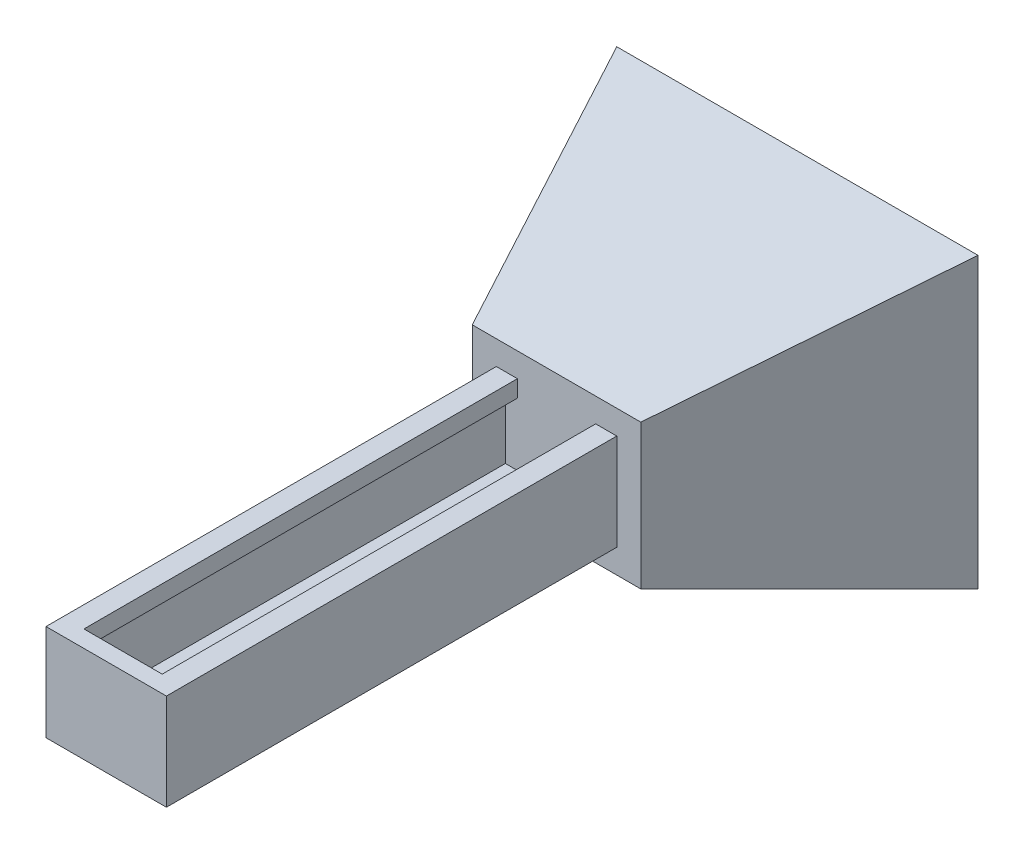
ISO-10303-21;
HEADER;
FILE_DESCRIPTION(('STEP AP214'),'2;1');
FILE_NAME('part.step','',(''),(''),'','','');
FILE_SCHEMA(('AUTOMOTIVE_DESIGN { 1 0 10303 214 1 1 1 1 }'));
ENDSEC;
DATA;
#1=APPLICATION_CONTEXT('core data for automotive mechanical design processes');
#2=APPLICATION_PROTOCOL_DEFINITION('international standard','automotive_design',2000,#1);
#3=PRODUCT_CONTEXT('',#1,'mechanical');
#4=PRODUCT('Part','Part','',(#3));
#5=PRODUCT_RELATED_PRODUCT_CATEGORY('part','',(#4));
#6=PRODUCT_DEFINITION_FORMATION('','',#4);
#7=PRODUCT_DEFINITION_CONTEXT('part definition',#1,'design');
#8=PRODUCT_DEFINITION('design','',#6,#7);
#9=PRODUCT_DEFINITION_SHAPE('','',#8);
#10=(LENGTH_UNIT() NAMED_UNIT(*) SI_UNIT(.MILLI.,.METRE.));
#11=(NAMED_UNIT(*) PLANE_ANGLE_UNIT() SI_UNIT($,.RADIAN.));
#12=(NAMED_UNIT(*) SI_UNIT($,.STERADIAN.) SOLID_ANGLE_UNIT());
#13=UNCERTAINTY_MEASURE_WITH_UNIT(LENGTH_MEASURE(1.E-05),#10,'distance_accuracy_value','');
#14=(GEOMETRIC_REPRESENTATION_CONTEXT(3) GLOBAL_UNCERTAINTY_ASSIGNED_CONTEXT((#13)) GLOBAL_UNIT_ASSIGNED_CONTEXT((#10,
#11,#12)) REPRESENTATION_CONTEXT('',''));
#15=CARTESIAN_POINT('',(0.,0.,0.));
#16=DIRECTION('',(0.,0.,1.));
#17=DIRECTION('',(1.,0.,0.));
#18=AXIS2_PLACEMENT_3D('',#15,#16,#17);
#19=CARTESIAN_POINT('',(0.,0.,-500.));
#20=DIRECTION('',(0.,0.,1.));
#21=DIRECTION('',(1.,0.,0.));
#22=AXIS2_PLACEMENT_3D('',#19,#20,#21);
#23=PLANE('',#22);
#24=DIRECTION('',(0.,-1.,0.));
#25=VECTOR('',#24,1.);
#26=CARTESIAN_POINT('',(-375.,-300.,-500.));
#27=LINE('',#26,#25);
#28=CARTESIAN_POINT('',(-375.,300.,-500.));
#29=VERTEX_POINT('',#28);
#30=CARTESIAN_POINT('',(-375.,-300.,-500.));
#31=VERTEX_POINT('',#30);
#32=EDGE_CURVE('E261',#29,#31,#27,.T.);
#33=ORIENTED_EDGE('',*,*,#32,.F.);
#34=DIRECTION('',(-1.,0.,0.));
#35=VECTOR('',#34,1.);
#36=CARTESIAN_POINT('',(375.,300.,-500.));
#37=LINE('',#36,#35);
#38=CARTESIAN_POINT('',(375.,300.,-500.));
#39=VERTEX_POINT('',#38);
#40=EDGE_CURVE('E271',#39,#29,#37,.T.);
#41=ORIENTED_EDGE('',*,*,#40,.F.);
#42=DIRECTION('',(0.,1.,0.));
#43=VECTOR('',#42,1.);
#44=CARTESIAN_POINT('',(375.,-300.,-500.));
#45=LINE('',#44,#43);
#46=CARTESIAN_POINT('',(375.,-300.,-500.));
#47=VERTEX_POINT('',#46);
#48=EDGE_CURVE('E268',#47,#39,#45,.T.);
#49=ORIENTED_EDGE('',*,*,#48,.F.);
#50=DIRECTION('',(1.,0.,0.));
#51=VECTOR('',#50,1.);
#52=CARTESIAN_POINT('',(375.,-300.,-500.));
#53=LINE('',#52,#51);
#54=EDGE_CURVE('E266',#31,#47,#53,.T.);
#55=ORIENTED_EDGE('',*,*,#54,.F.);
#56=EDGE_LOOP('',(#33,#41,#49,#55));
#57=FACE_BOUND('',#56,.T.);
#58=ADVANCED_FACE('F36',(#57),#23,.F.);
#59=CARTESIAN_POINT('',(0.,0.,0.));
#60=DIRECTION('',(0.,0.,1.));
#61=DIRECTION('',(1.,0.,0.));
#62=AXIS2_PLACEMENT_3D('',#59,#60,#61);
#63=PLANE('',#62);
#64=DIRECTION('',(0.,1.,0.));
#65=VECTOR('',#64,1.);
#66=CARTESIAN_POINT('',(81.2500000000006,0.,0.));
#67=LINE('',#66,#65);
#68=CARTESIAN_POINT('',(81.2500000000006,65.0000000000007,0.));
#69=VERTEX_POINT('',#68);
#70=CARTESIAN_POINT('',(81.2500000000006,100.,0.));
#71=VERTEX_POINT('',#70);
#72=EDGE_CURVE('E178',#69,#71,#67,.T.);
#73=ORIENTED_EDGE('',*,*,#72,.T.);
#74=DIRECTION('',(-1.,0.,0.));
#75=VECTOR('',#74,1.);
#76=CARTESIAN_POINT('',(0.,100.,0.));
#77=LINE('',#76,#75);
#78=CARTESIAN_POINT('',(125.,100.,0.));
#79=VERTEX_POINT('',#78);
#80=EDGE_CURVE('E183',#79,#71,#77,.T.);
#81=ORIENTED_EDGE('',*,*,#80,.F.);
#82=DIRECTION('',(0.,1.,0.));
#83=VECTOR('',#82,1.);
#84=CARTESIAN_POINT('',(125.,0.,0.));
#85=LINE('',#84,#83);
#86=CARTESIAN_POINT('',(125.,-100.,0.));
#87=VERTEX_POINT('',#86);
#88=EDGE_CURVE('E228',#87,#79,#85,.T.);
#89=ORIENTED_EDGE('',*,*,#88,.F.);
#90=DIRECTION('',(-1.,0.,0.));
#91=VECTOR('',#90,1.);
#92=CARTESIAN_POINT('',(0.,-100.,0.));
#93=LINE('',#92,#91);
#94=CARTESIAN_POINT('',(-125.,-100.,0.));
#95=VERTEX_POINT('',#94);
#96=EDGE_CURVE('E225',#87,#95,#93,.T.);
#97=ORIENTED_EDGE('',*,*,#96,.T.);
#98=DIRECTION('',(0.,1.,0.));
#99=VECTOR('',#98,1.);
#100=CARTESIAN_POINT('',(-125.,0.,0.));
#101=LINE('',#100,#99);
#102=CARTESIAN_POINT('',(-125.,100.,0.));
#103=VERTEX_POINT('',#102);
#104=EDGE_CURVE('E223',#95,#103,#101,.T.);
#105=ORIENTED_EDGE('',*,*,#104,.T.);
#106=CARTESIAN_POINT('',(-81.2500000000002,100.,0.));
#107=VERTEX_POINT('',#106);
#108=EDGE_CURVE('E154',#107,#103,#77,.T.);
#109=ORIENTED_EDGE('',*,*,#108,.F.);
#110=DIRECTION('',(0.,-1.,0.));
#111=VECTOR('',#110,1.);
#112=CARTESIAN_POINT('',(-81.2500000000002,0.,0.));
#113=LINE('',#112,#111);
#114=CARTESIAN_POINT('',(-81.2500000000002,65.0000000000001,0.));
#115=VERTEX_POINT('',#114);
#116=EDGE_CURVE('E219',#107,#115,#113,.T.);
#117=ORIENTED_EDGE('',*,*,#116,.T.);
#118=DIRECTION('',(-1.,0.,0.));
#119=VECTOR('',#118,1.);
#120=CARTESIAN_POINT('',(0.,65.0000000000001,0.));
#121=LINE('',#120,#119);
#122=CARTESIAN_POINT('',(-106.25,65.0000000000001,0.));
#123=VERTEX_POINT('',#122);
#124=EDGE_CURVE('E216',#115,#123,#121,.T.);
#125=ORIENTED_EDGE('',*,*,#124,.T.);
#126=DIRECTION('',(0.,-1.,0.));
#127=VECTOR('',#126,1.);
#128=CARTESIAN_POINT('',(-106.25,0.,0.));
#129=LINE('',#128,#127);
#130=CARTESIAN_POINT('',(-106.25,-65.0000000000003,0.));
#131=VERTEX_POINT('',#130);
#132=EDGE_CURVE('E213',#123,#131,#129,.T.);
#133=ORIENTED_EDGE('',*,*,#132,.T.);
#134=DIRECTION('',(1.,0.,0.));
#135=VECTOR('',#134,1.);
#136=CARTESIAN_POINT('',(0.,-65.0000000000003,0.));
#137=LINE('',#136,#135);
#138=CARTESIAN_POINT('',(106.250000000001,-65.0000000000003,0.));
#139=VERTEX_POINT('',#138);
#140=EDGE_CURVE('E210',#131,#139,#137,.T.);
#141=ORIENTED_EDGE('',*,*,#140,.T.);
#142=DIRECTION('',(0.,1.,0.));
#143=VECTOR('',#142,1.);
#144=CARTESIAN_POINT('',(106.250000000001,0.,0.));
#145=LINE('',#144,#143);
#146=CARTESIAN_POINT('',(106.250000000001,65.0000000000001,0.));
#147=VERTEX_POINT('',#146);
#148=EDGE_CURVE('E207',#139,#147,#145,.T.);
#149=ORIENTED_EDGE('',*,*,#148,.T.);
#150=DIRECTION('',(-1.,0.,0.));
#151=VECTOR('',#150,1.);
#152=CARTESIAN_POINT('',(1.58761892521404E-12,65.0000000000027,0.));
#153=LINE('',#152,#151);
#154=EDGE_CURVE('E204',#147,#69,#153,.T.);
#155=ORIENTED_EDGE('',*,*,#154,.T.);
#156=EDGE_LOOP('',(#73,#81,#89,#97,#105,#109,#117,#125,#133,#141,#149,#155));
#157=FACE_BOUND('',#156,.T.);
#158=DIRECTION('',(1.,0.,0.));
#159=VECTOR('',#158,1.);
#160=CARTESIAN_POINT('',(-375.,-150.,0.));
#161=LINE('',#160,#159);
#162=CARTESIAN_POINT('',(-175.,-150.,0.));
#163=VERTEX_POINT('',#162);
#164=CARTESIAN_POINT('',(175.,-150.,0.));
#165=VERTEX_POINT('',#164);
#166=EDGE_CURVE('E59',#163,#165,#161,.T.);
#167=ORIENTED_EDGE('',*,*,#166,.T.);
#168=DIRECTION('',(0.,-1.,0.));
#169=VECTOR('',#168,1.);
#170=CARTESIAN_POINT('',(175.,300.,0.));
#171=LINE('',#170,#169);
#172=CARTESIAN_POINT('',(175.,150.,0.));
#173=VERTEX_POINT('',#172);
#174=EDGE_CURVE('E257',#173,#165,#171,.T.);
#175=ORIENTED_EDGE('',*,*,#174,.F.);
#176=DIRECTION('',(1.,0.,0.));
#177=VECTOR('',#176,1.);
#178=CARTESIAN_POINT('',(-375.,150.,0.));
#179=LINE('',#178,#177);
#180=CARTESIAN_POINT('',(-175.,150.,0.));
#181=VERTEX_POINT('',#180);
#182=EDGE_CURVE('E248',#181,#173,#179,.T.);
#183=ORIENTED_EDGE('',*,*,#182,.F.);
#184=DIRECTION('',(0.,-1.,0.));
#185=VECTOR('',#184,1.);
#186=CARTESIAN_POINT('',(-175.,300.,0.));
#187=LINE('',#186,#185);
#188=EDGE_CURVE('E258',#181,#163,#187,.T.);
#189=ORIENTED_EDGE('',*,*,#188,.T.);
#190=EDGE_LOOP('',(#167,#175,#183,#189));
#191=FACE_BOUND('',#190,.T.);
#192=ADVANCED_FACE('F38',(#157,#191),#63,.T.);
#193=CARTESIAN_POINT('',(175.,300.,0.));
#194=DIRECTION('',(-0.928476690885259,0.,-0.371390676354104));
#195=DIRECTION('',(-0.371390676354104,0.,0.928476690885259));
#196=AXIS2_PLACEMENT_3D('',#193,#194,#195);
#197=PLANE('',#196);
#198=ORIENTED_EDGE('',*,*,#174,.T.);
#199=DIRECTION('',(0.357770876399967,-0.268328157299975,-0.894427190999916));
#200=VECTOR('',#199,1.);
#201=CARTESIAN_POINT('',(131.8,-117.6,108.));
#202=LINE('',#201,#200);
#203=EDGE_CURVE('E254',#165,#47,#202,.T.);
#204=ORIENTED_EDGE('',*,*,#203,.T.);
#205=ORIENTED_EDGE('',*,*,#48,.T.);
#206=DIRECTION('',(-0.357770876399966,-0.268328157299975,0.894427190999916));
#207=VECTOR('',#206,1.);
#208=CARTESIAN_POINT('',(189.4,160.8,-36.));
#209=LINE('',#208,#207);
#210=EDGE_CURVE('E250',#39,#173,#209,.T.);
#211=ORIENTED_EDGE('',*,*,#210,.T.);
#212=EDGE_LOOP('',(#198,#204,#205,#211));
#213=FACE_BOUND('',#212,.T.);
#214=ADVANCED_FACE('F285',(#213),#197,.F.);
#215=CARTESIAN_POINT('',(-175.,300.,0.));
#216=DIRECTION('',(0.928476690885259,0.,-0.371390676354104));
#217=DIRECTION('',(-0.371390676354104,0.,-0.928476690885259));
#218=AXIS2_PLACEMENT_3D('',#215,#216,#217);
#219=PLANE('',#218);
#220=ORIENTED_EDGE('',*,*,#32,.T.);
#221=DIRECTION('',(0.357770876399966,0.268328157299975,0.894427190999916));
#222=VECTOR('',#221,1.);
#223=CARTESIAN_POINT('',(-131.8,-117.6,108.));
#224=LINE('',#223,#222);
#225=EDGE_CURVE('E11',#31,#163,#224,.T.);
#226=ORIENTED_EDGE('',*,*,#225,.T.);
#227=ORIENTED_EDGE('',*,*,#188,.F.);
#228=DIRECTION('',(-0.357770876399967,0.268328157299975,-0.894427190999916));
#229=VECTOR('',#228,1.);
#230=CARTESIAN_POINT('',(-189.4,160.8,-36.));
#231=LINE('',#230,#229);
#232=EDGE_CURVE('E44',#181,#29,#231,.T.);
#233=ORIENTED_EDGE('',*,*,#232,.T.);
#234=EDGE_LOOP('',(#220,#226,#227,#233));
#235=FACE_BOUND('',#234,.T.);
#236=ADVANCED_FACE('F276',(#235),#219,.F.);
#237=CARTESIAN_POINT('',(-375.,150.,0.));
#238=DIRECTION('',(0.,-0.957826285221151,-0.287347885566345));
#239=DIRECTION('',(0.,0.287347885566345,-0.957826285221151));
#240=AXIS2_PLACEMENT_3D('',#237,#238,#239);
#241=PLANE('',#240);
#242=ORIENTED_EDGE('',*,*,#40,.T.);
#243=ORIENTED_EDGE('',*,*,#232,.F.);
#244=ORIENTED_EDGE('',*,*,#182,.T.);
#245=ORIENTED_EDGE('',*,*,#210,.F.);
#246=EDGE_LOOP('',(#242,#243,#244,#245));
#247=FACE_BOUND('',#246,.T.);
#248=ADVANCED_FACE('F288',(#247),#241,.F.);
#249=CARTESIAN_POINT('',(-375.,-150.,0.));
#250=DIRECTION('',(0.,0.957826285221151,-0.287347885566346));
#251=DIRECTION('',(0.,0.287347885566346,0.957826285221151));
#252=AXIS2_PLACEMENT_3D('',#249,#250,#251);
#253=PLANE('',#252);
#254=ORIENTED_EDGE('',*,*,#166,.F.);
#255=ORIENTED_EDGE('',*,*,#225,.F.);
#256=ORIENTED_EDGE('',*,*,#54,.T.);
#257=ORIENTED_EDGE('',*,*,#203,.F.);
#258=EDGE_LOOP('',(#254,#255,#256,#257));
#259=FACE_BOUND('',#258,.T.);
#260=ADVANCED_FACE('F283',(#259),#253,.F.);
#261=CARTESIAN_POINT('',(81.2500000000006,0.,900.));
#262=DIRECTION('',(-1.,0.,0.));
#263=DIRECTION('',(0.,-1.,0.));
#264=AXIS2_PLACEMENT_3D('',#261,#262,#263);
#265=PLANE('',#264);
#266=ORIENTED_EDGE('',*,*,#72,.F.);
#267=DIRECTION('',(0.,0.,-1.));
#268=VECTOR('',#267,1.);
#269=CARTESIAN_POINT('',(81.2500000000006,65.0000000000007,900.));
#270=LINE('',#269,#268);
#271=CARTESIAN_POINT('',(81.2500000000006,65.0000000000007,900.));
#272=VERTEX_POINT('',#271);
#273=EDGE_CURVE('E246',#272,#69,#270,.T.);
#274=ORIENTED_EDGE('',*,*,#273,.F.);
#275=DIRECTION('',(0.,1.,0.));
#276=VECTOR('',#275,1.);
#277=CARTESIAN_POINT('',(81.2500000000006,0.,900.));
#278=LINE('',#277,#276);
#279=CARTESIAN_POINT('',(81.2500000000006,100.,900.));
#280=VERTEX_POINT('',#279);
#281=EDGE_CURVE('E179',#272,#280,#278,.T.);
#282=ORIENTED_EDGE('',*,*,#281,.T.);
#283=DIRECTION('',(0.,0.,-1.));
#284=VECTOR('',#283,1.);
#285=CARTESIAN_POINT('',(81.2500000000006,100.,900.));
#286=LINE('',#285,#284);
#287=EDGE_CURVE('E201',#280,#71,#286,.T.);
#288=ORIENTED_EDGE('',*,*,#287,.T.);
#289=EDGE_LOOP('',(#266,#274,#282,#288));
#290=FACE_BOUND('',#289,.T.);
#291=ADVANCED_FACE('F295',(#290),#265,.T.);
#292=CARTESIAN_POINT('',(1.58761892521404E-12,65.0000000000027,900.));
#293=DIRECTION('',(0.,-1.,0.));
#294=DIRECTION('',(1.,0.,0.));
#295=AXIS2_PLACEMENT_3D('',#292,#293,#294);
#296=PLANE('',#295);
#297=ORIENTED_EDGE('',*,*,#154,.F.);
#298=DIRECTION('',(0.,0.,-1.));
#299=VECTOR('',#298,1.);
#300=CARTESIAN_POINT('',(106.250000000001,65.0000000000001,900.));
#301=LINE('',#300,#299);
#302=CARTESIAN_POINT('',(106.250000000001,65.0000000000001,900.));
#303=VERTEX_POINT('',#302);
#304=EDGE_CURVE('E244',#303,#147,#301,.T.);
#305=ORIENTED_EDGE('',*,*,#304,.F.);
#306=DIRECTION('',(-1.,0.,0.));
#307=VECTOR('',#306,1.);
#308=CARTESIAN_POINT('',(1.58761892521404E-12,65.0000000000027,900.));
#309=LINE('',#308,#307);
#310=EDGE_CURVE('E182',#303,#272,#309,.T.);
#311=ORIENTED_EDGE('',*,*,#310,.T.);
#312=ORIENTED_EDGE('',*,*,#273,.T.);
#313=EDGE_LOOP('',(#297,#305,#311,#312));
#314=FACE_BOUND('',#313,.T.);
#315=ADVANCED_FACE('F337',(#314),#296,.T.);
#316=CARTESIAN_POINT('',(106.250000000001,0.,900.));
#317=DIRECTION('',(-1.,0.,0.));
#318=DIRECTION('',(0.,0.,1.));
#319=AXIS2_PLACEMENT_3D('',#316,#317,#318);
#320=PLANE('',#319);
#321=ORIENTED_EDGE('',*,*,#148,.F.);
#322=DIRECTION('',(0.,0.,-1.));
#323=VECTOR('',#322,1.);
#324=CARTESIAN_POINT('',(106.250000000001,-65.0000000000003,900.));
#325=LINE('',#324,#323);
#326=CARTESIAN_POINT('',(106.250000000001,-65.0000000000003,900.));
#327=VERTEX_POINT('',#326);
#328=EDGE_CURVE('E242',#327,#139,#325,.T.);
#329=ORIENTED_EDGE('',*,*,#328,.F.);
#330=DIRECTION('',(0.,1.,0.));
#331=VECTOR('',#330,1.);
#332=CARTESIAN_POINT('',(106.250000000001,0.,900.));
#333=LINE('',#332,#331);
#334=EDGE_CURVE('E186',#327,#303,#333,.T.);
#335=ORIENTED_EDGE('',*,*,#334,.T.);
#336=ORIENTED_EDGE('',*,*,#304,.T.);
#337=EDGE_LOOP('',(#321,#329,#335,#336));
#338=FACE_BOUND('',#337,.T.);
#339=ADVANCED_FACE('F347',(#338),#320,.T.);
#340=CARTESIAN_POINT('',(0.,-65.0000000000003,900.));
#341=DIRECTION('',(0.,1.,0.));
#342=DIRECTION('',(0.,0.,1.));
#343=AXIS2_PLACEMENT_3D('',#340,#341,#342);
#344=PLANE('',#343);
#345=ORIENTED_EDGE('',*,*,#140,.F.);
#346=DIRECTION('',(0.,0.,-1.));
#347=VECTOR('',#346,1.);
#348=CARTESIAN_POINT('',(-106.25,-65.0000000000003,900.));
#349=LINE('',#348,#347);
#350=CARTESIAN_POINT('',(-106.25,-65.0000000000003,900.));
#351=VERTEX_POINT('',#350);
#352=EDGE_CURVE('E240',#351,#131,#349,.T.);
#353=ORIENTED_EDGE('',*,*,#352,.F.);
#354=DIRECTION('',(1.,0.,0.));
#355=VECTOR('',#354,1.);
#356=CARTESIAN_POINT('',(0.,-65.0000000000003,900.));
#357=LINE('',#356,#355);
#358=EDGE_CURVE('E189',#351,#327,#357,.T.);
#359=ORIENTED_EDGE('',*,*,#358,.T.);
#360=ORIENTED_EDGE('',*,*,#328,.T.);
#361=EDGE_LOOP('',(#345,#353,#359,#360));
#362=FACE_BOUND('',#361,.T.);
#363=ADVANCED_FACE('F357',(#362),#344,.T.);
#364=CARTESIAN_POINT('',(-106.25,0.,900.));
#365=DIRECTION('',(1.,0.,0.));
#366=DIRECTION('',(0.,1.,0.));
#367=AXIS2_PLACEMENT_3D('',#364,#365,#366);
#368=PLANE('',#367);
#369=ORIENTED_EDGE('',*,*,#132,.F.);
#370=DIRECTION('',(0.,0.,-1.));
#371=VECTOR('',#370,1.);
#372=CARTESIAN_POINT('',(-106.25,65.0000000000001,900.));
#373=LINE('',#372,#371);
#374=CARTESIAN_POINT('',(-106.25,65.0000000000001,900.));
#375=VERTEX_POINT('',#374);
#376=EDGE_CURVE('E238',#375,#123,#373,.T.);
#377=ORIENTED_EDGE('',*,*,#376,.F.);
#378=DIRECTION('',(0.,-1.,0.));
#379=VECTOR('',#378,1.);
#380=CARTESIAN_POINT('',(-106.25,0.,900.));
#381=LINE('',#380,#379);
#382=EDGE_CURVE('E192',#375,#351,#381,.T.);
#383=ORIENTED_EDGE('',*,*,#382,.T.);
#384=ORIENTED_EDGE('',*,*,#352,.T.);
#385=EDGE_LOOP('',(#369,#377,#383,#384));
#386=FACE_BOUND('',#385,.T.);
#387=ADVANCED_FACE('F368',(#386),#368,.T.);
#388=CARTESIAN_POINT('',(0.,65.0000000000001,900.));
#389=DIRECTION('',(0.,-1.,0.));
#390=DIRECTION('',(0.,0.,-1.));
#391=AXIS2_PLACEMENT_3D('',#388,#389,#390);
#392=PLANE('',#391);
#393=ORIENTED_EDGE('',*,*,#124,.F.);
#394=DIRECTION('',(0.,0.,-1.));
#395=VECTOR('',#394,1.);
#396=CARTESIAN_POINT('',(-81.2500000000002,65.0000000000001,900.));
#397=LINE('',#396,#395);
#398=CARTESIAN_POINT('',(-81.2500000000002,65.0000000000001,900.));
#399=VERTEX_POINT('',#398);
#400=EDGE_CURVE('E236',#399,#115,#397,.T.);
#401=ORIENTED_EDGE('',*,*,#400,.F.);
#402=DIRECTION('',(-1.,0.,0.));
#403=VECTOR('',#402,1.);
#404=CARTESIAN_POINT('',(0.,65.0000000000001,900.));
#405=LINE('',#404,#403);
#406=EDGE_CURVE('E195',#399,#375,#405,.T.);
#407=ORIENTED_EDGE('',*,*,#406,.T.);
#408=ORIENTED_EDGE('',*,*,#376,.T.);
#409=EDGE_LOOP('',(#393,#401,#407,#408));
#410=FACE_BOUND('',#409,.T.);
#411=ADVANCED_FACE('F379',(#410),#392,.T.);
#412=CARTESIAN_POINT('',(-81.2500000000002,0.,900.));
#413=DIRECTION('',(1.,0.,0.));
#414=DIRECTION('',(0.,1.,0.));
#415=AXIS2_PLACEMENT_3D('',#412,#413,#414);
#416=PLANE('',#415);
#417=ORIENTED_EDGE('',*,*,#116,.F.);
#418=DIRECTION('',(0.,0.,-1.));
#419=VECTOR('',#418,1.);
#420=CARTESIAN_POINT('',(-81.2500000000002,100.,900.));
#421=LINE('',#420,#419);
#422=CARTESIAN_POINT('',(-81.2500000000002,100.,900.));
#423=VERTEX_POINT('',#422);
#424=EDGE_CURVE('E158',#423,#107,#421,.T.);
#425=ORIENTED_EDGE('',*,*,#424,.F.);
#426=DIRECTION('',(0.,-1.,0.));
#427=VECTOR('',#426,1.);
#428=CARTESIAN_POINT('',(-81.2500000000002,0.,900.));
#429=LINE('',#428,#427);
#430=EDGE_CURVE('E198',#423,#399,#429,.T.);
#431=ORIENTED_EDGE('',*,*,#430,.T.);
#432=ORIENTED_EDGE('',*,*,#400,.T.);
#433=EDGE_LOOP('',(#417,#425,#431,#432));
#434=FACE_BOUND('',#433,.T.);
#435=ADVANCED_FACE('F389',(#434),#416,.T.);
#436=CARTESIAN_POINT('',(0.,100.,900.));
#437=DIRECTION('',(0.,-1.,0.));
#438=DIRECTION('',(1.,0.,0.));
#439=AXIS2_PLACEMENT_3D('',#436,#437,#438);
#440=PLANE('',#439);
#441=ORIENTED_EDGE('',*,*,#108,.T.);
#442=DIRECTION('',(0.,0.,-1.));
#443=VECTOR('',#442,1.);
#444=CARTESIAN_POINT('',(-125.,100.,900.));
#445=LINE('',#444,#443);
#446=CARTESIAN_POINT('',(-125.,100.,935.));
#447=VERTEX_POINT('',#446);
#448=EDGE_CURVE('E147',#447,#103,#445,.T.);
#449=ORIENTED_EDGE('',*,*,#448,.F.);
#450=DIRECTION('',(1.,0.,0.));
#451=VECTOR('',#450,1.);
#452=CARTESIAN_POINT('',(-328.039405042469,100.,935.));
#453=LINE('',#452,#451);
#454=CARTESIAN_POINT('',(125.,100.,935.));
#455=VERTEX_POINT('',#454);
#456=EDGE_CURVE('E151',#447,#455,#453,.T.);
#457=ORIENTED_EDGE('',*,*,#456,.T.);
#458=DIRECTION('',(0.,0.,-1.));
#459=VECTOR('',#458,1.);
#460=CARTESIAN_POINT('',(125.,100.,900.));
#461=LINE('',#460,#459);
#462=EDGE_CURVE('E51',#455,#79,#461,.T.);
#463=ORIENTED_EDGE('',*,*,#462,.T.);
#464=ORIENTED_EDGE('',*,*,#80,.T.);
#465=ORIENTED_EDGE('',*,*,#287,.F.);
#466=DIRECTION('',(1.,0.,0.));
#467=VECTOR('',#466,1.);
#468=CARTESIAN_POINT('',(-328.039405042469,100.,900.));
#469=LINE('',#468,#467);
#470=EDGE_CURVE('E176',#423,#280,#469,.T.);
#471=ORIENTED_EDGE('',*,*,#470,.F.);
#472=ORIENTED_EDGE('',*,*,#424,.T.);
#473=EDGE_LOOP('',(#441,#449,#457,#463,#464,#465,#471,#472));
#474=FACE_BOUND('',#473,.T.);
#475=ADVANCED_FACE('F149',(#474),#440,.F.);
#476=CARTESIAN_POINT('',(-125.,0.,900.));
#477=DIRECTION('',(-1.,0.,0.));
#478=DIRECTION('',(0.,-1.,0.));
#479=AXIS2_PLACEMENT_3D('',#476,#477,#478);
#480=PLANE('',#479);
#481=ORIENTED_EDGE('',*,*,#104,.F.);
#482=DIRECTION('',(0.,0.,-1.));
#483=VECTOR('',#482,1.);
#484=CARTESIAN_POINT('',(-125.,-100.,900.));
#485=LINE('',#484,#483);
#486=CARTESIAN_POINT('',(-125.,-100.,935.));
#487=VERTEX_POINT('',#486);
#488=EDGE_CURVE('E159',#487,#95,#485,.T.);
#489=ORIENTED_EDGE('',*,*,#488,.F.);
#490=DIRECTION('',(0.,-1.,0.));
#491=VECTOR('',#490,1.);
#492=CARTESIAN_POINT('',(-125.,-99.9999999999999,935.));
#493=LINE('',#492,#491);
#494=EDGE_CURVE('E162',#447,#487,#493,.T.);
#495=ORIENTED_EDGE('',*,*,#494,.F.);
#496=ORIENTED_EDGE('',*,*,#448,.T.);
#497=EDGE_LOOP('',(#481,#489,#495,#496));
#498=FACE_BOUND('',#497,.T.);
#499=ADVANCED_FACE('F163',(#498),#480,.T.);
#500=CARTESIAN_POINT('',(0.,-100.,900.));
#501=DIRECTION('',(0.,-1.,0.));
#502=DIRECTION('',(1.,0.,0.));
#503=AXIS2_PLACEMENT_3D('',#500,#501,#502);
#504=PLANE('',#503);
#505=ORIENTED_EDGE('',*,*,#96,.F.);
#506=DIRECTION('',(0.,0.,-1.));
#507=VECTOR('',#506,1.);
#508=CARTESIAN_POINT('',(125.,-100.,900.));
#509=LINE('',#508,#507);
#510=CARTESIAN_POINT('',(125.,-100.,935.));
#511=VERTEX_POINT('',#510);
#512=EDGE_CURVE('E232',#511,#87,#509,.T.);
#513=ORIENTED_EDGE('',*,*,#512,.F.);
#514=DIRECTION('',(1.,0.,0.));
#515=VECTOR('',#514,1.);
#516=CARTESIAN_POINT('',(-328.03940504247,-99.9999999999999,935.));
#517=LINE('',#516,#515);
#518=EDGE_CURVE('E167',#487,#511,#517,.T.);
#519=ORIENTED_EDGE('',*,*,#518,.F.);
#520=ORIENTED_EDGE('',*,*,#488,.T.);
#521=EDGE_LOOP('',(#505,#513,#519,#520));
#522=FACE_BOUND('',#521,.T.);
#523=ADVANCED_FACE('F418',(#522),#504,.T.);
#524=CARTESIAN_POINT('',(125.,0.,900.));
#525=DIRECTION('',(-1.,0.,0.));
#526=DIRECTION('',(0.,-1.,0.));
#527=AXIS2_PLACEMENT_3D('',#524,#525,#526);
#528=PLANE('',#527);
#529=ORIENTED_EDGE('',*,*,#88,.T.);
#530=ORIENTED_EDGE('',*,*,#462,.F.);
#531=DIRECTION('',(0.,-1.,0.));
#532=VECTOR('',#531,1.);
#533=CARTESIAN_POINT('',(125.,-100.,935.));
#534=LINE('',#533,#532);
#535=EDGE_CURVE('E171',#455,#511,#534,.T.);
#536=ORIENTED_EDGE('',*,*,#535,.T.);
#537=ORIENTED_EDGE('',*,*,#512,.T.);
#538=EDGE_LOOP('',(#529,#530,#536,#537));
#539=FACE_BOUND('',#538,.T.);
#540=ADVANCED_FACE('F428',(#539),#528,.F.);
#541=CARTESIAN_POINT('',(-328.03940504247,-99.9999999999999,900.));
#542=DIRECTION('',(0.,0.,-1.));
#543=DIRECTION('',(-1.,0.,0.));
#544=AXIS2_PLACEMENT_3D('',#541,#542,#543);
#545=PLANE('',#544);
#546=ORIENTED_EDGE('',*,*,#281,.F.);
#547=ORIENTED_EDGE('',*,*,#310,.F.);
#548=ORIENTED_EDGE('',*,*,#334,.F.);
#549=ORIENTED_EDGE('',*,*,#358,.F.);
#550=ORIENTED_EDGE('',*,*,#382,.F.);
#551=ORIENTED_EDGE('',*,*,#406,.F.);
#552=ORIENTED_EDGE('',*,*,#430,.F.);
#553=ORIENTED_EDGE('',*,*,#470,.T.);
#554=EDGE_LOOP('',(#546,#547,#548,#549,#550,#551,#552,#553));
#555=FACE_BOUND('',#554,.T.);
#556=ADVANCED_FACE('F439',(#555),#545,.T.);
#557=CARTESIAN_POINT('',(-328.03940504247,-99.9999999999999,935.));
#558=DIRECTION('',(0.,0.,1.));
#559=DIRECTION('',(1.,0.,0.));
#560=AXIS2_PLACEMENT_3D('',#557,#558,#559);
#561=PLANE('',#560);
#562=ORIENTED_EDGE('',*,*,#456,.F.);
#563=ORIENTED_EDGE('',*,*,#494,.T.);
#564=ORIENTED_EDGE('',*,*,#518,.T.);
#565=ORIENTED_EDGE('',*,*,#535,.F.);
#566=EDGE_LOOP('',(#562,#563,#564,#565));
#567=FACE_BOUND('',#566,.T.);
#568=ADVANCED_FACE('F169',(#567),#561,.T.);
#569=CLOSED_SHELL('',(#58,#192,#214,#236,#248,#260,#291,#315,#339,#363,#387,#411,#435,#475,#499,
#523,#540,#556,#568));
#570=MANIFOLD_SOLID_BREP('B2',#569);
#571=ADVANCED_BREP_SHAPE_REPRESENTATION('',(#18,#570),#14);
#572=SHAPE_DEFINITION_REPRESENTATION(#9,#571);
ENDSEC;
END-ISO-10303-21;
